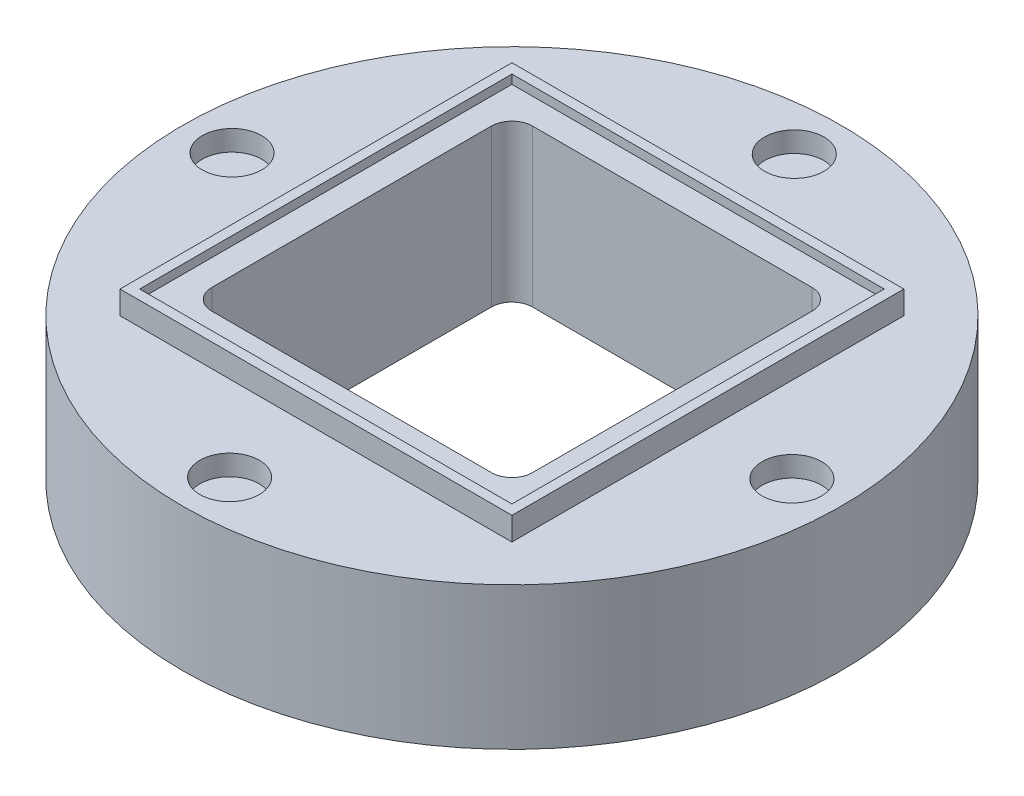
ISO-10303-21;
HEADER;
FILE_DESCRIPTION(('STEP AP214'),'2;1');
FILE_NAME('part.step','',(''),(''),'','','');
FILE_SCHEMA(('AUTOMOTIVE_DESIGN { 1 0 10303 214 1 1 1 1 }'));
ENDSEC;
DATA;
#1=APPLICATION_CONTEXT('core data for automotive mechanical design processes');
#2=APPLICATION_PROTOCOL_DEFINITION('international standard','automotive_design',2000,#1);
#3=PRODUCT_CONTEXT('',#1,'mechanical');
#4=PRODUCT('Part','Part','',(#3));
#5=PRODUCT_RELATED_PRODUCT_CATEGORY('part','',(#4));
#6=PRODUCT_DEFINITION_FORMATION('','',#4);
#7=PRODUCT_DEFINITION_CONTEXT('part definition',#1,'design');
#8=PRODUCT_DEFINITION('design','',#6,#7);
#9=PRODUCT_DEFINITION_SHAPE('','',#8);
#10=(LENGTH_UNIT() NAMED_UNIT(*) SI_UNIT(.MILLI.,.METRE.));
#11=(NAMED_UNIT(*) PLANE_ANGLE_UNIT() SI_UNIT($,.RADIAN.));
#12=(NAMED_UNIT(*) SI_UNIT($,.STERADIAN.) SOLID_ANGLE_UNIT());
#13=UNCERTAINTY_MEASURE_WITH_UNIT(LENGTH_MEASURE(1.E-05),#10,'distance_accuracy_value','');
#14=(GEOMETRIC_REPRESENTATION_CONTEXT(3) GLOBAL_UNCERTAINTY_ASSIGNED_CONTEXT((#13)) GLOBAL_UNIT_ASSIGNED_CONTEXT((#10,
#11,#12)) REPRESENTATION_CONTEXT('',''));
#15=CARTESIAN_POINT('',(0.,0.,0.));
#16=DIRECTION('',(0.,0.,1.));
#17=DIRECTION('',(1.,0.,0.));
#18=AXIS2_PLACEMENT_3D('',#15,#16,#17);
#19=CARTESIAN_POINT('',(0.,0.,0.));
#20=DIRECTION('',(0.,1.,0.));
#21=DIRECTION('',(0.,0.,1.));
#22=AXIS2_PLACEMENT_3D('',#19,#20,#21);
#23=PLANE('',#22);
#24=CARTESIAN_POINT('',(0.,0.,0.));
#25=DIRECTION('',(0.,1.,0.));
#26=DIRECTION('',(0.,0.,1.));
#27=AXIS2_PLACEMENT_3D('',#24,#25,#26);
#28=CIRCLE('',#27,18.5);
#29=CARTESIAN_POINT('',(0.,0.,18.5));
#30=VERTEX_POINT('',#29);
#31=EDGE_CURVE('E297',#30,#30,#28,.T.);
#32=ORIENTED_EDGE('',*,*,#31,.F.);
#33=EDGE_LOOP('',(#32));
#34=FACE_BOUND('',#33,.T.);
#35=CARTESIAN_POINT('',(-7.85,0.,-7.84999999999964));
#36=DIRECTION('',(0.,1.,0.));
#37=DIRECTION('',(0.,0.,1.));
#38=AXIS2_PLACEMENT_3D('',#35,#36,#37);
#39=CIRCLE('',#38,1.15);
#40=CARTESIAN_POINT('',(-9.,0.,-7.84999999999964));
#41=VERTEX_POINT('',#40);
#42=CARTESIAN_POINT('',(-7.85,0.,-9.));
#43=VERTEX_POINT('',#42);
#44=EDGE_CURVE('E160',#41,#43,#39,.F.);
#45=ORIENTED_EDGE('',*,*,#44,.F.);
#46=DIRECTION('',(0.,0.,-1.));
#47=VECTOR('',#46,1.);
#48=CARTESIAN_POINT('',(-9.,0.,0.));
#49=LINE('',#48,#47);
#50=CARTESIAN_POINT('',(-9.,0.,7.85000000000035));
#51=VERTEX_POINT('',#50);
#52=EDGE_CURVE('E152',#51,#41,#49,.T.);
#53=ORIENTED_EDGE('',*,*,#52,.F.);
#54=CARTESIAN_POINT('',(-7.84999999999964,0.,7.85000000000035));
#55=DIRECTION('',(0.,1.,0.));
#56=DIRECTION('',(0.,0.,1.));
#57=AXIS2_PLACEMENT_3D('',#54,#55,#56);
#58=CIRCLE('',#57,1.15);
#59=CARTESIAN_POINT('',(-7.84999999999964,0.,9.));
#60=VERTEX_POINT('',#59);
#61=EDGE_CURVE('E159',#60,#51,#58,.F.);
#62=ORIENTED_EDGE('',*,*,#61,.F.);
#63=DIRECTION('',(1.,0.,0.));
#64=VECTOR('',#63,1.);
#65=CARTESIAN_POINT('',(0.,0.,9.));
#66=LINE('',#65,#64);
#67=CARTESIAN_POINT('',(7.85000000000036,0.,9.));
#68=VERTEX_POINT('',#67);
#69=EDGE_CURVE('E175',#60,#68,#66,.T.);
#70=ORIENTED_EDGE('',*,*,#69,.T.);
#71=CARTESIAN_POINT('',(7.85000000000036,0.,7.85));
#72=DIRECTION('',(0.,1.,0.));
#73=DIRECTION('',(0.,0.,1.));
#74=AXIS2_PLACEMENT_3D('',#71,#72,#73);
#75=CIRCLE('',#74,1.15);
#76=CARTESIAN_POINT('',(9.,0.,7.85));
#77=VERTEX_POINT('',#76);
#78=EDGE_CURVE('E178',#77,#68,#75,.F.);
#79=ORIENTED_EDGE('',*,*,#78,.F.);
#80=DIRECTION('',(0.,0.,-1.));
#81=VECTOR('',#80,1.);
#82=CARTESIAN_POINT('',(9.,0.,0.));
#83=LINE('',#82,#81);
#84=CARTESIAN_POINT('',(9.,0.,-7.85));
#85=VERTEX_POINT('',#84);
#86=EDGE_CURVE('E180',#77,#85,#83,.T.);
#87=ORIENTED_EDGE('',*,*,#86,.T.);
#88=CARTESIAN_POINT('',(7.85,0.,-7.85));
#89=DIRECTION('',(0.,1.,0.));
#90=DIRECTION('',(0.,0.,1.));
#91=AXIS2_PLACEMENT_3D('',#88,#89,#90);
#92=CIRCLE('',#91,1.15);
#93=CARTESIAN_POINT('',(7.85,0.,-9.));
#94=VERTEX_POINT('',#93);
#95=EDGE_CURVE('E183',#94,#85,#92,.F.);
#96=ORIENTED_EDGE('',*,*,#95,.F.);
#97=DIRECTION('',(1.,0.,0.));
#98=VECTOR('',#97,1.);
#99=CARTESIAN_POINT('',(0.,0.,-9.));
#100=LINE('',#99,#98);
#101=EDGE_CURVE('E164',#43,#94,#100,.T.);
#102=ORIENTED_EDGE('',*,*,#101,.F.);
#103=EDGE_LOOP('',(#45,#53,#62,#70,#79,#87,#96,#102));
#104=FACE_BOUND('',#103,.T.);
#105=ADVANCED_FACE('F39',(#34,#104),#23,.F.);
#106=CARTESIAN_POINT('',(0.,8.8,0.));
#107=DIRECTION('',(0.,1.,0.));
#108=DIRECTION('',(0.,0.,1.));
#109=AXIS2_PLACEMENT_3D('',#106,#107,#108);
#110=PLANE('',#109);
#111=DIRECTION('',(-1.,0.,0.));
#112=VECTOR('',#111,1.);
#113=CARTESIAN_POINT('',(0.,8.8,10.45));
#114=LINE('',#113,#112);
#115=CARTESIAN_POINT('',(10.45,8.8,10.45));
#116=VERTEX_POINT('',#115);
#117=CARTESIAN_POINT('',(-10.45,8.8,10.45));
#118=VERTEX_POINT('',#117);
#119=EDGE_CURVE('E221',#116,#118,#114,.T.);
#120=ORIENTED_EDGE('',*,*,#119,.F.);
#121=DIRECTION('',(0.,0.,-1.));
#122=VECTOR('',#121,1.);
#123=CARTESIAN_POINT('',(10.45,8.8,0.));
#124=LINE('',#123,#122);
#125=CARTESIAN_POINT('',(10.45,8.8,-10.45));
#126=VERTEX_POINT('',#125);
#127=EDGE_CURVE('E11',#116,#126,#124,.T.);
#128=ORIENTED_EDGE('',*,*,#127,.T.);
#129=DIRECTION('',(-1.,0.,0.));
#130=VECTOR('',#129,1.);
#131=CARTESIAN_POINT('',(0.,8.8,-10.45));
#132=LINE('',#131,#130);
#133=CARTESIAN_POINT('',(-10.45,8.8,-10.45));
#134=VERTEX_POINT('',#133);
#135=EDGE_CURVE('E205',#126,#134,#132,.T.);
#136=ORIENTED_EDGE('',*,*,#135,.T.);
#137=DIRECTION('',(0.,0.,-1.));
#138=VECTOR('',#137,1.);
#139=CARTESIAN_POINT('',(-10.45,8.8,0.));
#140=LINE('',#139,#138);
#141=EDGE_CURVE('E219',#118,#134,#140,.T.);
#142=ORIENTED_EDGE('',*,*,#141,.F.);
#143=EDGE_LOOP('',(#120,#128,#136,#142));
#144=FACE_BOUND('',#143,.T.);
#145=DIRECTION('',(0.,0.,-1.));
#146=VECTOR('',#145,1.);
#147=CARTESIAN_POINT('',(-9.,8.8,0.));
#148=LINE('',#147,#146);
#149=CARTESIAN_POINT('',(-9.,8.8,7.85000000000035));
#150=VERTEX_POINT('',#149);
#151=CARTESIAN_POINT('',(-9.,8.8,-7.84999999999964));
#152=VERTEX_POINT('',#151);
#153=EDGE_CURVE('E187',#150,#152,#148,.T.);
#154=ORIENTED_EDGE('',*,*,#153,.T.);
#155=CARTESIAN_POINT('',(-7.85,8.8,-7.84999999999964));
#156=DIRECTION('',(0.,1.,0.));
#157=DIRECTION('',(0.,0.,1.));
#158=AXIS2_PLACEMENT_3D('',#155,#156,#157);
#159=CIRCLE('',#158,1.15);
#160=CARTESIAN_POINT('',(-7.85,8.8,-9.));
#161=VERTEX_POINT('',#160);
#162=EDGE_CURVE('E62',#152,#161,#159,.F.);
#163=ORIENTED_EDGE('',*,*,#162,.T.);
#164=DIRECTION('',(1.,0.,0.));
#165=VECTOR('',#164,1.);
#166=CARTESIAN_POINT('',(0.,8.8,-9.));
#167=LINE('',#166,#165);
#168=CARTESIAN_POINT('',(7.85,8.8,-9.));
#169=VERTEX_POINT('',#168);
#170=EDGE_CURVE('E168',#161,#169,#167,.T.);
#171=ORIENTED_EDGE('',*,*,#170,.T.);
#172=CARTESIAN_POINT('',(7.85,8.8,-7.85));
#173=DIRECTION('',(0.,1.,0.));
#174=DIRECTION('',(0.,0.,1.));
#175=AXIS2_PLACEMENT_3D('',#172,#173,#174);
#176=CIRCLE('',#175,1.15);
#177=CARTESIAN_POINT('',(9.,8.8,-7.85));
#178=VERTEX_POINT('',#177);
#179=EDGE_CURVE('E171',#169,#178,#176,.F.);
#180=ORIENTED_EDGE('',*,*,#179,.T.);
#181=DIRECTION('',(0.,0.,-1.));
#182=VECTOR('',#181,1.);
#183=CARTESIAN_POINT('',(9.,8.8,0.));
#184=LINE('',#183,#182);
#185=CARTESIAN_POINT('',(9.,8.8,7.85));
#186=VERTEX_POINT('',#185);
#187=EDGE_CURVE('E198',#186,#178,#184,.T.);
#188=ORIENTED_EDGE('',*,*,#187,.F.);
#189=CARTESIAN_POINT('',(7.85000000000036,8.8,7.85));
#190=DIRECTION('',(0.,1.,0.));
#191=DIRECTION('',(0.,0.,1.));
#192=AXIS2_PLACEMENT_3D('',#189,#190,#191);
#193=CIRCLE('',#192,1.15);
#194=CARTESIAN_POINT('',(7.85000000000036,8.8,9.));
#195=VERTEX_POINT('',#194);
#196=EDGE_CURVE('E195',#186,#195,#193,.F.);
#197=ORIENTED_EDGE('',*,*,#196,.T.);
#198=DIRECTION('',(1.,0.,0.));
#199=VECTOR('',#198,1.);
#200=CARTESIAN_POINT('',(0.,8.8,9.));
#201=LINE('',#200,#199);
#202=CARTESIAN_POINT('',(-7.84999999999964,8.8,9.));
#203=VERTEX_POINT('',#202);
#204=EDGE_CURVE('E192',#203,#195,#201,.T.);
#205=ORIENTED_EDGE('',*,*,#204,.F.);
#206=CARTESIAN_POINT('',(-7.84999999999964,8.8,7.85000000000035));
#207=DIRECTION('',(0.,1.,0.));
#208=DIRECTION('',(0.,0.,1.));
#209=AXIS2_PLACEMENT_3D('',#206,#207,#208);
#210=CIRCLE('',#209,1.15);
#211=EDGE_CURVE('E189',#203,#150,#210,.F.);
#212=ORIENTED_EDGE('',*,*,#211,.T.);
#213=EDGE_LOOP('',(#154,#163,#171,#180,#188,#197,#205,#212));
#214=FACE_BOUND('',#213,.T.);
#215=ADVANCED_FACE('F306',(#144,#214),#110,.T.);
#216=CARTESIAN_POINT('',(0.,8.,0.));
#217=DIRECTION('',(0.,-1.,0.));
#218=DIRECTION('',(0.,0.,-1.));
#219=AXIS2_PLACEMENT_3D('',#216,#217,#218);
#220=CYLINDRICAL_SURFACE('',#219,18.5);
#221=CARTESIAN_POINT('',(0.,8.,0.));
#222=DIRECTION('',(0.,1.,0.));
#223=DIRECTION('',(0.,0.,1.));
#224=AXIS2_PLACEMENT_3D('',#221,#222,#223);
#225=CIRCLE('',#224,18.5);
#226=CARTESIAN_POINT('',(0.,8.,18.5));
#227=VERTEX_POINT('',#226);
#228=EDGE_CURVE('E47',#227,#227,#225,.T.);
#229=ORIENTED_EDGE('',*,*,#228,.F.);
#230=EDGE_LOOP('',(#229));
#231=FACE_BOUND('',#230,.T.);
#232=ORIENTED_EDGE('',*,*,#31,.T.);
#233=EDGE_LOOP('',(#232));
#234=FACE_BOUND('',#233,.T.);
#235=ADVANCED_FACE('F41',(#231,#234),#220,.T.);
#236=CARTESIAN_POINT('',(0.,8.,0.));
#237=DIRECTION('',(0.,1.,0.));
#238=DIRECTION('',(0.,0.,1.));
#239=AXIS2_PLACEMENT_3D('',#236,#237,#238);
#240=PLANE('',#239);
#241=DIRECTION('',(0.,0.,-1.));
#242=VECTOR('',#241,1.);
#243=CARTESIAN_POINT('',(-11.,8.,0.));
#244=LINE('',#243,#242);
#245=CARTESIAN_POINT('',(-11.,8.,11.));
#246=VERTEX_POINT('',#245);
#247=CARTESIAN_POINT('',(-11.,8.,-11.));
#248=VERTEX_POINT('',#247);
#249=EDGE_CURVE('E223',#246,#248,#244,.T.);
#250=ORIENTED_EDGE('',*,*,#249,.T.);
#251=DIRECTION('',(-1.,0.,0.));
#252=VECTOR('',#251,1.);
#253=CARTESIAN_POINT('',(0.,8.,-11.));
#254=LINE('',#253,#252);
#255=CARTESIAN_POINT('',(11.,8.,-11.));
#256=VERTEX_POINT('',#255);
#257=EDGE_CURVE('E228',#256,#248,#254,.T.);
#258=ORIENTED_EDGE('',*,*,#257,.F.);
#259=DIRECTION('',(0.,0.,-1.));
#260=VECTOR('',#259,1.);
#261=CARTESIAN_POINT('',(11.,8.,0.));
#262=LINE('',#261,#260);
#263=CARTESIAN_POINT('',(11.,8.,11.));
#264=VERTEX_POINT('',#263);
#265=EDGE_CURVE('E252',#264,#256,#262,.T.);
#266=ORIENTED_EDGE('',*,*,#265,.F.);
#267=DIRECTION('',(-1.,0.,0.));
#268=VECTOR('',#267,1.);
#269=CARTESIAN_POINT('',(0.,8.,11.));
#270=LINE('',#269,#268);
#271=EDGE_CURVE('E249',#264,#246,#270,.T.);
#272=ORIENTED_EDGE('',*,*,#271,.T.);
#273=EDGE_LOOP('',(#250,#258,#266,#272));
#274=FACE_BOUND('',#273,.T.);
#275=CARTESIAN_POINT('',(15.7813355243341,8.,0.0667747530941572));
#276=DIRECTION('',(0.,1.,0.));
#277=DIRECTION('',(-1.,0.,0.));
#278=AXIS2_PLACEMENT_3D('',#275,#276,#277);
#279=CIRCLE('',#278,1.67);
#280=CARTESIAN_POINT('',(14.1113355243341,8.,0.0667747530941747));
#281=VERTEX_POINT('',#280);
#282=EDGE_CURVE('E269',#281,#281,#279,.T.);
#283=ORIENTED_EDGE('',*,*,#282,.F.);
#284=EDGE_LOOP('',(#283));
#285=FACE_BOUND('',#284,.T.);
#286=CARTESIAN_POINT('',(-0.0667747530943225,8.,15.7813355243341));
#287=DIRECTION('',(0.,1.,0.));
#288=DIRECTION('',(0.,0.,-1.));
#289=AXIS2_PLACEMENT_3D('',#286,#287,#288);
#290=CIRCLE('',#289,1.67);
#291=CARTESIAN_POINT('',(-0.0667747530943225,8.,14.1113355243341));
#292=VERTEX_POINT('',#291);
#293=EDGE_CURVE('E279',#292,#292,#290,.T.);
#294=ORIENTED_EDGE('',*,*,#293,.F.);
#295=EDGE_LOOP('',(#294));
#296=FACE_BOUND('',#295,.T.);
#297=CARTESIAN_POINT('',(-15.7813355243341,8.,-0.0667747530942674));
#298=DIRECTION('',(0.,1.,0.));
#299=DIRECTION('',(1.,0.,0.));
#300=AXIS2_PLACEMENT_3D('',#297,#298,#299);
#301=CIRCLE('',#300,1.67);
#302=CARTESIAN_POINT('',(-14.1113355243341,8.,-0.0667747530942732));
#303=VERTEX_POINT('',#302);
#304=EDGE_CURVE('E285',#303,#303,#301,.T.);
#305=ORIENTED_EDGE('',*,*,#304,.F.);
#306=EDGE_LOOP('',(#305));
#307=FACE_BOUND('',#306,.T.);
#308=CARTESIAN_POINT('',(0.0667747530943225,8.,-15.7813355243341));
#309=DIRECTION('',(0.,1.,0.));
#310=DIRECTION('',(0.,0.,1.));
#311=AXIS2_PLACEMENT_3D('',#308,#309,#310);
#312=CIRCLE('',#311,1.67);
#313=CARTESIAN_POINT('',(0.0667747530943225,8.,-14.1113355243341));
#314=VERTEX_POINT('',#313);
#315=EDGE_CURVE('E291',#314,#314,#312,.T.);
#316=ORIENTED_EDGE('',*,*,#315,.F.);
#317=EDGE_LOOP('',(#316));
#318=FACE_BOUND('',#317,.T.);
#319=ORIENTED_EDGE('',*,*,#228,.T.);
#320=EDGE_LOOP('',(#319));
#321=FACE_BOUND('',#320,.T.);
#322=ADVANCED_FACE('F313',(#274,#285,#296,#307,#318,#321),#240,.T.);
#323=CARTESIAN_POINT('',(0.0667747530943225,6.85,-15.7813355243341));
#324=DIRECTION('',(0.,1.,0.));
#325=DIRECTION('',(0.,0.,1.));
#326=AXIS2_PLACEMENT_3D('',#323,#324,#325);
#327=CYLINDRICAL_SURFACE('',#326,1.67);
#328=CARTESIAN_POINT('',(0.0667747530943225,6.85,-15.7813355243341));
#329=DIRECTION('',(0.,1.,0.));
#330=DIRECTION('',(0.,0.,1.));
#331=AXIS2_PLACEMENT_3D('',#328,#329,#330);
#332=CIRCLE('',#331,1.67);
#333=CARTESIAN_POINT('',(0.0667747530943225,6.85,-14.1113355243341));
#334=VERTEX_POINT('',#333);
#335=EDGE_CURVE('E294',#334,#334,#332,.T.);
#336=ORIENTED_EDGE('',*,*,#335,.F.);
#337=EDGE_LOOP('',(#336));
#338=FACE_BOUND('',#337,.T.);
#339=ORIENTED_EDGE('',*,*,#315,.T.);
#340=EDGE_LOOP('',(#339));
#341=FACE_BOUND('',#340,.T.);
#342=ADVANCED_FACE('F316',(#338,#341),#327,.F.);
#343=CARTESIAN_POINT('',(0.0667747530943225,6.85,-15.7813355243341));
#344=DIRECTION('',(0.,1.,0.));
#345=DIRECTION('',(0.,0.,1.));
#346=AXIS2_PLACEMENT_3D('',#343,#344,#345);
#347=PLANE('',#346);
#348=ORIENTED_EDGE('',*,*,#335,.T.);
#349=EDGE_LOOP('',(#348));
#350=FACE_BOUND('',#349,.T.);
#351=ADVANCED_FACE('F320',(#350),#347,.T.);
#352=CARTESIAN_POINT('',(-15.7813355243341,6.85,-0.0667747530942674));
#353=DIRECTION('',(0.,1.,0.));
#354=DIRECTION('',(0.,0.,1.));
#355=AXIS2_PLACEMENT_3D('',#352,#353,#354);
#356=CYLINDRICAL_SURFACE('',#355,1.67);
#357=CARTESIAN_POINT('',(-15.7813355243341,6.85,-0.0667747530942674));
#358=DIRECTION('',(0.,1.,0.));
#359=DIRECTION('',(1.,0.,0.));
#360=AXIS2_PLACEMENT_3D('',#357,#358,#359);
#361=CIRCLE('',#360,1.67);
#362=CARTESIAN_POINT('',(-14.1113355243341,6.85,-0.0667747530942732));
#363=VERTEX_POINT('',#362);
#364=EDGE_CURVE('E288',#363,#363,#361,.T.);
#365=ORIENTED_EDGE('',*,*,#364,.F.);
#366=EDGE_LOOP('',(#365));
#367=FACE_BOUND('',#366,.T.);
#368=ORIENTED_EDGE('',*,*,#304,.T.);
#369=EDGE_LOOP('',(#368));
#370=FACE_BOUND('',#369,.T.);
#371=ADVANCED_FACE('F324',(#367,#370),#356,.F.);
#372=CARTESIAN_POINT('',(-15.7813355243341,6.85,-0.0667747530942674));
#373=DIRECTION('',(0.,1.,0.));
#374=DIRECTION('',(1.,0.,0.));
#375=AXIS2_PLACEMENT_3D('',#372,#373,#374);
#376=PLANE('',#375);
#377=ORIENTED_EDGE('',*,*,#364,.T.);
#378=EDGE_LOOP('',(#377));
#379=FACE_BOUND('',#378,.T.);
#380=ADVANCED_FACE('F328',(#379),#376,.T.);
#381=CARTESIAN_POINT('',(-0.0667747530943225,6.85,15.7813355243341));
#382=DIRECTION('',(0.,1.,0.));
#383=DIRECTION('',(0.,0.,1.));
#384=AXIS2_PLACEMENT_3D('',#381,#382,#383);
#385=CYLINDRICAL_SURFACE('',#384,1.67);
#386=CARTESIAN_POINT('',(-0.0667747530943225,6.85,15.7813355243341));
#387=DIRECTION('',(0.,1.,0.));
#388=DIRECTION('',(0.,0.,-1.));
#389=AXIS2_PLACEMENT_3D('',#386,#387,#388);
#390=CIRCLE('',#389,1.67);
#391=CARTESIAN_POINT('',(-0.0667747530943225,6.85,14.1113355243341));
#392=VERTEX_POINT('',#391);
#393=EDGE_CURVE('E282',#392,#392,#390,.T.);
#394=ORIENTED_EDGE('',*,*,#393,.F.);
#395=EDGE_LOOP('',(#394));
#396=FACE_BOUND('',#395,.T.);
#397=ORIENTED_EDGE('',*,*,#293,.T.);
#398=EDGE_LOOP('',(#397));
#399=FACE_BOUND('',#398,.T.);
#400=ADVANCED_FACE('F332',(#396,#399),#385,.F.);
#401=CARTESIAN_POINT('',(-0.0667747530943225,6.85,15.7813355243341));
#402=DIRECTION('',(0.,1.,0.));
#403=DIRECTION('',(0.,0.,-1.));
#404=AXIS2_PLACEMENT_3D('',#401,#402,#403);
#405=PLANE('',#404);
#406=ORIENTED_EDGE('',*,*,#393,.T.);
#407=EDGE_LOOP('',(#406));
#408=FACE_BOUND('',#407,.T.);
#409=ADVANCED_FACE('F336',(#408),#405,.T.);
#410=CARTESIAN_POINT('',(15.7813355243341,6.85,0.0667747530941572));
#411=DIRECTION('',(0.,1.,0.));
#412=DIRECTION('',(0.,0.,1.));
#413=AXIS2_PLACEMENT_3D('',#410,#411,#412);
#414=CYLINDRICAL_SURFACE('',#413,1.67);
#415=CARTESIAN_POINT('',(15.7813355243341,6.85,0.0667747530941572));
#416=DIRECTION('',(0.,1.,0.));
#417=DIRECTION('',(-1.,0.,0.));
#418=AXIS2_PLACEMENT_3D('',#415,#416,#417);
#419=CIRCLE('',#418,1.67);
#420=CARTESIAN_POINT('',(14.1113355243341,6.85,0.0667747530941747));
#421=VERTEX_POINT('',#420);
#422=EDGE_CURVE('E276',#421,#421,#419,.T.);
#423=ORIENTED_EDGE('',*,*,#422,.F.);
#424=EDGE_LOOP('',(#423));
#425=FACE_BOUND('',#424,.T.);
#426=ORIENTED_EDGE('',*,*,#282,.T.);
#427=EDGE_LOOP('',(#426));
#428=FACE_BOUND('',#427,.T.);
#429=ADVANCED_FACE('F340',(#425,#428),#414,.F.);
#430=CARTESIAN_POINT('',(15.7813355243341,6.85,0.0667747530941572));
#431=DIRECTION('',(0.,1.,0.));
#432=DIRECTION('',(-1.,0.,0.));
#433=AXIS2_PLACEMENT_3D('',#430,#431,#432);
#434=PLANE('',#433);
#435=ORIENTED_EDGE('',*,*,#422,.T.);
#436=EDGE_LOOP('',(#435));
#437=FACE_BOUND('',#436,.T.);
#438=ADVANCED_FACE('F344',(#437),#434,.T.);
#439=CARTESIAN_POINT('',(0.,9.3,10.45));
#440=DIRECTION('',(0.,0.,1.));
#441=DIRECTION('',(1.,0.,0.));
#442=AXIS2_PLACEMENT_3D('',#439,#440,#441);
#443=PLANE('',#442);
#444=DIRECTION('',(0.,-1.,0.));
#445=VECTOR('',#444,1.);
#446=CARTESIAN_POINT('',(10.45,9.3,10.45));
#447=LINE('',#446,#445);
#448=CARTESIAN_POINT('',(10.45,9.3,10.45));
#449=VERTEX_POINT('',#448);
#450=EDGE_CURVE('E257',#449,#116,#447,.T.);
#451=ORIENTED_EDGE('',*,*,#450,.T.);
#452=ORIENTED_EDGE('',*,*,#119,.T.);
#453=DIRECTION('',(0.,-1.,0.));
#454=VECTOR('',#453,1.);
#455=CARTESIAN_POINT('',(-10.45,9.3,10.45));
#456=LINE('',#455,#454);
#457=CARTESIAN_POINT('',(-10.45,9.3,10.45));
#458=VERTEX_POINT('',#457);
#459=EDGE_CURVE('E266',#458,#118,#456,.T.);
#460=ORIENTED_EDGE('',*,*,#459,.F.);
#461=DIRECTION('',(-1.,0.,0.));
#462=VECTOR('',#461,1.);
#463=CARTESIAN_POINT('',(0.,9.3,10.45));
#464=LINE('',#463,#462);
#465=EDGE_CURVE('E235',#449,#458,#464,.T.);
#466=ORIENTED_EDGE('',*,*,#465,.F.);
#467=EDGE_LOOP('',(#451,#452,#460,#466));
#468=FACE_BOUND('',#467,.T.);
#469=ADVANCED_FACE('F348',(#468),#443,.F.);
#470=CARTESIAN_POINT('',(-10.45,9.3,0.));
#471=DIRECTION('',(-1.,0.,0.));
#472=DIRECTION('',(0.,0.,1.));
#473=AXIS2_PLACEMENT_3D('',#470,#471,#472);
#474=PLANE('',#473);
#475=ORIENTED_EDGE('',*,*,#459,.T.);
#476=ORIENTED_EDGE('',*,*,#141,.T.);
#477=DIRECTION('',(0.,-1.,0.));
#478=VECTOR('',#477,1.);
#479=CARTESIAN_POINT('',(-10.45,9.3,-10.45));
#480=LINE('',#479,#478);
#481=CARTESIAN_POINT('',(-10.45,9.3,-10.45));
#482=VERTEX_POINT('',#481);
#483=EDGE_CURVE('E263',#482,#134,#480,.T.);
#484=ORIENTED_EDGE('',*,*,#483,.F.);
#485=DIRECTION('',(0.,0.,-1.));
#486=VECTOR('',#485,1.);
#487=CARTESIAN_POINT('',(-10.45,9.3,0.));
#488=LINE('',#487,#486);
#489=EDGE_CURVE('E238',#458,#482,#488,.T.);
#490=ORIENTED_EDGE('',*,*,#489,.F.);
#491=EDGE_LOOP('',(#475,#476,#484,#490));
#492=FACE_BOUND('',#491,.T.);
#493=ADVANCED_FACE('F370',(#492),#474,.F.);
#494=CARTESIAN_POINT('',(0.,9.3,-10.45));
#495=DIRECTION('',(0.,0.,1.));
#496=DIRECTION('',(1.,0.,0.));
#497=AXIS2_PLACEMENT_3D('',#494,#495,#496);
#498=PLANE('',#497);
#499=ORIENTED_EDGE('',*,*,#135,.F.);
#500=DIRECTION('',(0.,-1.,0.));
#501=VECTOR('',#500,1.);
#502=CARTESIAN_POINT('',(10.45,9.3,-10.45));
#503=LINE('',#502,#501);
#504=CARTESIAN_POINT('',(10.45,9.3,-10.45));
#505=VERTEX_POINT('',#504);
#506=EDGE_CURVE('E260',#505,#126,#503,.T.);
#507=ORIENTED_EDGE('',*,*,#506,.F.);
#508=DIRECTION('',(-1.,0.,0.));
#509=VECTOR('',#508,1.);
#510=CARTESIAN_POINT('',(0.,9.3,-10.45));
#511=LINE('',#510,#509);
#512=EDGE_CURVE('E240',#505,#482,#511,.T.);
#513=ORIENTED_EDGE('',*,*,#512,.T.);
#514=ORIENTED_EDGE('',*,*,#483,.T.);
#515=EDGE_LOOP('',(#499,#507,#513,#514));
#516=FACE_BOUND('',#515,.T.);
#517=ADVANCED_FACE('F354',(#516),#498,.T.);
#518=CARTESIAN_POINT('',(-11.,9.3,0.));
#519=DIRECTION('',(-1.,0.,0.));
#520=DIRECTION('',(0.,0.,1.));
#521=AXIS2_PLACEMENT_3D('',#518,#519,#520);
#522=PLANE('',#521);
#523=DIRECTION('',(0.,-1.,0.));
#524=VECTOR('',#523,1.);
#525=CARTESIAN_POINT('',(-11.,9.3,-11.));
#526=LINE('',#525,#524);
#527=CARTESIAN_POINT('',(-11.,9.3,-11.));
#528=VERTEX_POINT('',#527);
#529=EDGE_CURVE('E246',#528,#248,#526,.T.);
#530=ORIENTED_EDGE('',*,*,#529,.T.);
#531=ORIENTED_EDGE('',*,*,#249,.F.);
#532=DIRECTION('',(0.,-1.,0.));
#533=VECTOR('',#532,1.);
#534=CARTESIAN_POINT('',(-11.,9.3,11.));
#535=LINE('',#534,#533);
#536=CARTESIAN_POINT('',(-11.,9.3,11.));
#537=VERTEX_POINT('',#536);
#538=EDGE_CURVE('E261',#537,#246,#535,.T.);
#539=ORIENTED_EDGE('',*,*,#538,.F.);
#540=DIRECTION('',(0.,0.,-1.));
#541=VECTOR('',#540,1.);
#542=CARTESIAN_POINT('',(-11.,9.3,0.));
#543=LINE('',#542,#541);
#544=EDGE_CURVE('E224',#537,#528,#543,.T.);
#545=ORIENTED_EDGE('',*,*,#544,.T.);
#546=EDGE_LOOP('',(#530,#531,#539,#545));
#547=FACE_BOUND('',#546,.T.);
#548=ADVANCED_FACE('F350',(#547),#522,.T.);
#549=CARTESIAN_POINT('',(0.,9.3,11.));
#550=DIRECTION('',(0.,0.,1.));
#551=DIRECTION('',(1.,0.,0.));
#552=AXIS2_PLACEMENT_3D('',#549,#550,#551);
#553=PLANE('',#552);
#554=ORIENTED_EDGE('',*,*,#538,.T.);
#555=ORIENTED_EDGE('',*,*,#271,.F.);
#556=DIRECTION('',(0.,-1.,0.));
#557=VECTOR('',#556,1.);
#558=CARTESIAN_POINT('',(11.,9.3,11.));
#559=LINE('',#558,#557);
#560=CARTESIAN_POINT('',(11.,9.3,11.));
#561=VERTEX_POINT('',#560);
#562=EDGE_CURVE('E273',#561,#264,#559,.T.);
#563=ORIENTED_EDGE('',*,*,#562,.F.);
#564=DIRECTION('',(-1.,0.,0.));
#565=VECTOR('',#564,1.);
#566=CARTESIAN_POINT('',(0.,9.3,11.));
#567=LINE('',#566,#565);
#568=EDGE_CURVE('E227',#561,#537,#567,.T.);
#569=ORIENTED_EDGE('',*,*,#568,.T.);
#570=EDGE_LOOP('',(#554,#555,#563,#569));
#571=FACE_BOUND('',#570,.T.);
#572=ADVANCED_FACE('F353',(#571),#553,.T.);
#573=CARTESIAN_POINT('',(11.,9.3,0.));
#574=DIRECTION('',(-1.,0.,0.));
#575=DIRECTION('',(0.,0.,1.));
#576=AXIS2_PLACEMENT_3D('',#573,#574,#575);
#577=PLANE('',#576);
#578=ORIENTED_EDGE('',*,*,#562,.T.);
#579=ORIENTED_EDGE('',*,*,#265,.T.);
#580=DIRECTION('',(0.,-1.,0.));
#581=VECTOR('',#580,1.);
#582=CARTESIAN_POINT('',(11.,9.3,-11.));
#583=LINE('',#582,#581);
#584=CARTESIAN_POINT('',(11.,9.3,-11.));
#585=VERTEX_POINT('',#584);
#586=EDGE_CURVE('E271',#585,#256,#583,.T.);
#587=ORIENTED_EDGE('',*,*,#586,.F.);
#588=DIRECTION('',(0.,0.,-1.));
#589=VECTOR('',#588,1.);
#590=CARTESIAN_POINT('',(11.,9.3,0.));
#591=LINE('',#590,#589);
#592=EDGE_CURVE('E231',#561,#585,#591,.T.);
#593=ORIENTED_EDGE('',*,*,#592,.F.);
#594=EDGE_LOOP('',(#578,#579,#587,#593));
#595=FACE_BOUND('',#594,.T.);
#596=ADVANCED_FACE('F358',(#595),#577,.F.);
#597=CARTESIAN_POINT('',(0.,9.3,-11.));
#598=DIRECTION('',(0.,0.,1.));
#599=DIRECTION('',(1.,0.,0.));
#600=AXIS2_PLACEMENT_3D('',#597,#598,#599);
#601=PLANE('',#600);
#602=ORIENTED_EDGE('',*,*,#586,.T.);
#603=ORIENTED_EDGE('',*,*,#257,.T.);
#604=ORIENTED_EDGE('',*,*,#529,.F.);
#605=DIRECTION('',(-1.,0.,0.));
#606=VECTOR('',#605,1.);
#607=CARTESIAN_POINT('',(0.,9.3,-11.));
#608=LINE('',#607,#606);
#609=EDGE_CURVE('E233',#585,#528,#608,.T.);
#610=ORIENTED_EDGE('',*,*,#609,.F.);
#611=EDGE_LOOP('',(#602,#603,#604,#610));
#612=FACE_BOUND('',#611,.T.);
#613=ADVANCED_FACE('F362',(#612),#601,.F.);
#614=CARTESIAN_POINT('',(10.45,9.3,0.));
#615=DIRECTION('',(-1.,0.,0.));
#616=DIRECTION('',(0.,0.,1.));
#617=AXIS2_PLACEMENT_3D('',#614,#615,#616);
#618=PLANE('',#617);
#619=ORIENTED_EDGE('',*,*,#127,.F.);
#620=ORIENTED_EDGE('',*,*,#450,.F.);
#621=DIRECTION('',(0.,0.,-1.));
#622=VECTOR('',#621,1.);
#623=CARTESIAN_POINT('',(10.45,9.3,0.));
#624=LINE('',#623,#622);
#625=EDGE_CURVE('E243',#449,#505,#624,.T.);
#626=ORIENTED_EDGE('',*,*,#625,.T.);
#627=ORIENTED_EDGE('',*,*,#506,.T.);
#628=EDGE_LOOP('',(#619,#620,#626,#627));
#629=FACE_BOUND('',#628,.T.);
#630=ADVANCED_FACE('F366',(#629),#618,.T.);
#631=CARTESIAN_POINT('',(0.,9.3,0.));
#632=DIRECTION('',(0.,1.,0.));
#633=DIRECTION('',(0.,0.,1.));
#634=AXIS2_PLACEMENT_3D('',#631,#632,#633);
#635=PLANE('',#634);
#636=ORIENTED_EDGE('',*,*,#544,.F.);
#637=ORIENTED_EDGE('',*,*,#568,.F.);
#638=ORIENTED_EDGE('',*,*,#592,.T.);
#639=ORIENTED_EDGE('',*,*,#609,.T.);
#640=EDGE_LOOP('',(#636,#637,#638,#639));
#641=FACE_BOUND('',#640,.T.);
#642=ORIENTED_EDGE('',*,*,#465,.T.);
#643=ORIENTED_EDGE('',*,*,#489,.T.);
#644=ORIENTED_EDGE('',*,*,#512,.F.);
#645=ORIENTED_EDGE('',*,*,#625,.F.);
#646=EDGE_LOOP('',(#642,#643,#644,#645));
#647=FACE_BOUND('',#646,.T.);
#648=ADVANCED_FACE('F380',(#641,#647),#635,.T.);
#649=CARTESIAN_POINT('',(-7.85,0.,-7.84999999999964));
#650=DIRECTION('',(0.,1.,0.));
#651=DIRECTION('',(0.,0.,1.));
#652=AXIS2_PLACEMENT_3D('',#649,#650,#651);
#653=CYLINDRICAL_SURFACE('',#652,1.15);
#654=ORIENTED_EDGE('',*,*,#162,.F.);
#655=DIRECTION('',(0.,1.,0.));
#656=VECTOR('',#655,1.);
#657=CARTESIAN_POINT('',(-9.,0.,-7.84999999999964));
#658=LINE('',#657,#656);
#659=EDGE_CURVE('E154',#41,#152,#658,.T.);
#660=ORIENTED_EDGE('',*,*,#659,.F.);
#661=ORIENTED_EDGE('',*,*,#44,.T.);
#662=DIRECTION('',(0.,1.,0.));
#663=VECTOR('',#662,1.);
#664=CARTESIAN_POINT('',(-7.85,0.,-9.));
#665=LINE('',#664,#663);
#666=EDGE_CURVE('E203',#43,#161,#665,.T.);
#667=ORIENTED_EDGE('',*,*,#666,.T.);
#668=EDGE_LOOP('',(#654,#660,#661,#667));
#669=FACE_BOUND('',#668,.T.);
#670=ADVANCED_FACE('F162',(#669),#653,.F.);
#671=CARTESIAN_POINT('',(0.,0.,-9.));
#672=DIRECTION('',(0.,0.,1.));
#673=DIRECTION('',(1.,0.,0.));
#674=AXIS2_PLACEMENT_3D('',#671,#672,#673);
#675=PLANE('',#674);
#676=ORIENTED_EDGE('',*,*,#170,.F.);
#677=ORIENTED_EDGE('',*,*,#666,.F.);
#678=ORIENTED_EDGE('',*,*,#101,.T.);
#679=DIRECTION('',(0.,1.,0.));
#680=VECTOR('',#679,1.);
#681=CARTESIAN_POINT('',(7.85,0.,-9.));
#682=LINE('',#681,#680);
#683=EDGE_CURVE('E206',#94,#169,#682,.T.);
#684=ORIENTED_EDGE('',*,*,#683,.T.);
#685=EDGE_LOOP('',(#676,#677,#678,#684));
#686=FACE_BOUND('',#685,.T.);
#687=ADVANCED_FACE('F387',(#686),#675,.T.);
#688=CARTESIAN_POINT('',(7.85,0.,-7.85));
#689=DIRECTION('',(0.,1.,0.));
#690=DIRECTION('',(0.,0.,1.));
#691=AXIS2_PLACEMENT_3D('',#688,#689,#690);
#692=CYLINDRICAL_SURFACE('',#691,1.15);
#693=ORIENTED_EDGE('',*,*,#179,.F.);
#694=ORIENTED_EDGE('',*,*,#683,.F.);
#695=ORIENTED_EDGE('',*,*,#95,.T.);
#696=DIRECTION('',(0.,1.,0.));
#697=VECTOR('',#696,1.);
#698=CARTESIAN_POINT('',(9.,0.,-7.85));
#699=LINE('',#698,#697);
#700=EDGE_CURVE('E208',#85,#178,#699,.T.);
#701=ORIENTED_EDGE('',*,*,#700,.T.);
#702=EDGE_LOOP('',(#693,#694,#695,#701));
#703=FACE_BOUND('',#702,.T.);
#704=ADVANCED_FACE('F405',(#703),#692,.F.);
#705=CARTESIAN_POINT('',(9.,0.,0.));
#706=DIRECTION('',(1.,0.,0.));
#707=DIRECTION('',(0.,0.,-1.));
#708=AXIS2_PLACEMENT_3D('',#705,#706,#707);
#709=PLANE('',#708);
#710=ORIENTED_EDGE('',*,*,#187,.T.);
#711=ORIENTED_EDGE('',*,*,#700,.F.);
#712=ORIENTED_EDGE('',*,*,#86,.F.);
#713=DIRECTION('',(0.,1.,0.));
#714=VECTOR('',#713,1.);
#715=CARTESIAN_POINT('',(9.,0.,7.85));
#716=LINE('',#715,#714);
#717=EDGE_CURVE('E210',#77,#186,#716,.T.);
#718=ORIENTED_EDGE('',*,*,#717,.T.);
#719=EDGE_LOOP('',(#710,#711,#712,#718));
#720=FACE_BOUND('',#719,.T.);
#721=ADVANCED_FACE('F401',(#720),#709,.F.);
#722=CARTESIAN_POINT('',(7.85000000000036,0.,7.85));
#723=DIRECTION('',(0.,1.,0.));
#724=DIRECTION('',(0.,0.,1.));
#725=AXIS2_PLACEMENT_3D('',#722,#723,#724);
#726=CYLINDRICAL_SURFACE('',#725,1.15);
#727=ORIENTED_EDGE('',*,*,#196,.F.);
#728=ORIENTED_EDGE('',*,*,#717,.F.);
#729=ORIENTED_EDGE('',*,*,#78,.T.);
#730=DIRECTION('',(0.,1.,0.));
#731=VECTOR('',#730,1.);
#732=CARTESIAN_POINT('',(7.85000000000036,0.,9.));
#733=LINE('',#732,#731);
#734=EDGE_CURVE('E212',#68,#195,#733,.T.);
#735=ORIENTED_EDGE('',*,*,#734,.T.);
#736=EDGE_LOOP('',(#727,#728,#729,#735));
#737=FACE_BOUND('',#736,.T.);
#738=ADVANCED_FACE('F397',(#737),#726,.F.);
#739=CARTESIAN_POINT('',(0.,0.,9.));
#740=DIRECTION('',(0.,0.,1.));
#741=DIRECTION('',(1.,0.,0.));
#742=AXIS2_PLACEMENT_3D('',#739,#740,#741);
#743=PLANE('',#742);
#744=ORIENTED_EDGE('',*,*,#204,.T.);
#745=ORIENTED_EDGE('',*,*,#734,.F.);
#746=ORIENTED_EDGE('',*,*,#69,.F.);
#747=DIRECTION('',(0.,1.,0.));
#748=VECTOR('',#747,1.);
#749=CARTESIAN_POINT('',(-7.84999999999964,0.,9.));
#750=LINE('',#749,#748);
#751=EDGE_CURVE('E214',#60,#203,#750,.T.);
#752=ORIENTED_EDGE('',*,*,#751,.T.);
#753=EDGE_LOOP('',(#744,#745,#746,#752));
#754=FACE_BOUND('',#753,.T.);
#755=ADVANCED_FACE('F393',(#754),#743,.F.);
#756=CARTESIAN_POINT('',(-7.84999999999964,0.,7.85000000000035));
#757=DIRECTION('',(0.,1.,0.));
#758=DIRECTION('',(0.,0.,1.));
#759=AXIS2_PLACEMENT_3D('',#756,#757,#758);
#760=CYLINDRICAL_SURFACE('',#759,1.15);
#761=ORIENTED_EDGE('',*,*,#211,.F.);
#762=ORIENTED_EDGE('',*,*,#751,.F.);
#763=ORIENTED_EDGE('',*,*,#61,.T.);
#764=DIRECTION('',(0.,1.,0.));
#765=VECTOR('',#764,1.);
#766=CARTESIAN_POINT('',(-9.,0.,7.85000000000035));
#767=LINE('',#766,#765);
#768=EDGE_CURVE('E54',#51,#150,#767,.T.);
#769=ORIENTED_EDGE('',*,*,#768,.T.);
#770=EDGE_LOOP('',(#761,#762,#763,#769));
#771=FACE_BOUND('',#770,.T.);
#772=ADVANCED_FACE('F390',(#771),#760,.F.);
#773=CARTESIAN_POINT('',(-9.,0.,0.));
#774=DIRECTION('',(1.,0.,0.));
#775=DIRECTION('',(0.,0.,-1.));
#776=AXIS2_PLACEMENT_3D('',#773,#774,#775);
#777=PLANE('',#776);
#778=ORIENTED_EDGE('',*,*,#153,.F.);
#779=ORIENTED_EDGE('',*,*,#768,.F.);
#780=ORIENTED_EDGE('',*,*,#52,.T.);
#781=ORIENTED_EDGE('',*,*,#659,.T.);
#782=EDGE_LOOP('',(#778,#779,#780,#781));
#783=FACE_BOUND('',#782,.T.);
#784=ADVANCED_FACE('F153',(#783),#777,.T.);
#785=CLOSED_SHELL('',(#105,#215,#235,#322,#342,#351,#371,#380,#400,#409,#429,#438,#469,#493,
#517,#548,#572,#596,#613,#630,#648,#670,#687,#704,#721,#738,#755,#772,#784));
#786=MANIFOLD_SOLID_BREP('B2',#785);
#787=ADVANCED_BREP_SHAPE_REPRESENTATION('',(#18,#786),#14);
#788=SHAPE_DEFINITION_REPRESENTATION(#9,#787);
ENDSEC;
END-ISO-10303-21;
